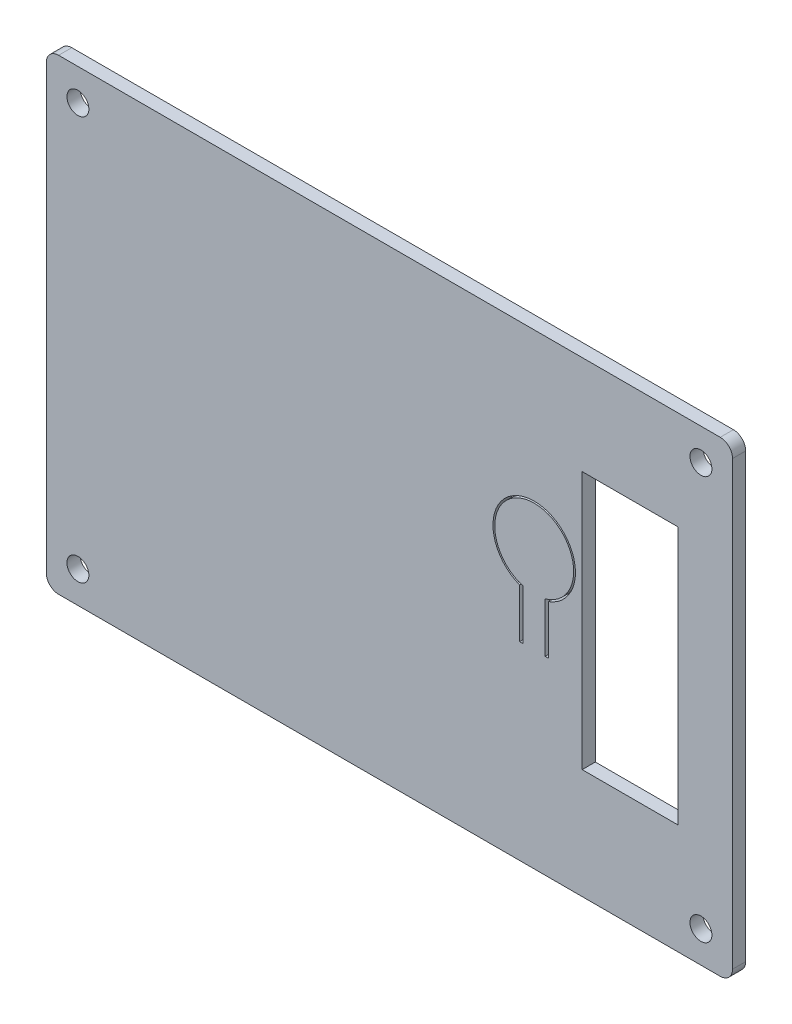
ISO-10303-21;
HEADER;
FILE_DESCRIPTION(('STEP AP214'),'2;1');
FILE_NAME('part.step','',(''),(''),'','','');
FILE_SCHEMA(('AUTOMOTIVE_DESIGN { 1 0 10303 214 1 1 1 1 }'));
ENDSEC;
DATA;
#1=APPLICATION_CONTEXT('core data for automotive mechanical design processes');
#2=APPLICATION_PROTOCOL_DEFINITION('international standard','automotive_design',2000,#1);
#3=PRODUCT_CONTEXT('',#1,'mechanical');
#4=PRODUCT('Part','Part','',(#3));
#5=PRODUCT_RELATED_PRODUCT_CATEGORY('part','',(#4));
#6=PRODUCT_DEFINITION_FORMATION('','',#4);
#7=PRODUCT_DEFINITION_CONTEXT('part definition',#1,'design');
#8=PRODUCT_DEFINITION('design','',#6,#7);
#9=PRODUCT_DEFINITION_SHAPE('','',#8);
#10=(LENGTH_UNIT() NAMED_UNIT(*) SI_UNIT(.MILLI.,.METRE.));
#11=(NAMED_UNIT(*) PLANE_ANGLE_UNIT() SI_UNIT($,.RADIAN.));
#12=(NAMED_UNIT(*) SI_UNIT($,.STERADIAN.) SOLID_ANGLE_UNIT());
#13=UNCERTAINTY_MEASURE_WITH_UNIT(LENGTH_MEASURE(1.E-05),#10,'distance_accuracy_value','');
#14=(GEOMETRIC_REPRESENTATION_CONTEXT(3) GLOBAL_UNCERTAINTY_ASSIGNED_CONTEXT((#13)) GLOBAL_UNIT_ASSIGNED_CONTEXT((#10,
#11,#12)) REPRESENTATION_CONTEXT('',''));
#15=CARTESIAN_POINT('',(0.,0.,0.));
#16=DIRECTION('',(0.,0.,1.));
#17=DIRECTION('',(1.,0.,0.));
#18=AXIS2_PLACEMENT_3D('',#15,#16,#17);
#19=CARTESIAN_POINT('',(0.,-4.27563523380666,11.7430789084998));
#20=DIRECTION('',(0.,-1.,0.));
#21=DIRECTION('',(0.,0.,-1.));
#22=AXIS2_PLACEMENT_3D('',#19,#20,#21);
#23=PLANE('',#22);
#24=DIRECTION('',(0.,0.,1.));
#25=VECTOR('',#24,1.);
#26=CARTESIAN_POINT('',(5.71503973713821,-4.27563523380666,11.7430789084998));
#27=LINE('',#26,#25);
#28=CARTESIAN_POINT('',(5.71503973713821,-4.27563523380666,12.7430789084998));
#29=VERTEX_POINT('',#28);
#30=CARTESIAN_POINT('',(5.71503973713821,-4.27563523380666,14.2430789084998));
#31=VERTEX_POINT('',#30);
#32=EDGE_CURVE('E207',#29,#31,#27,.T.);
#33=ORIENTED_EDGE('',*,*,#32,.F.);
#34=DIRECTION('',(-1.,0.,0.));
#35=VECTOR('',#34,1.);
#36=CARTESIAN_POINT('',(28.1648587015572,-4.27563523380666,12.7430789084998));
#37=LINE('',#36,#35);
#38=CARTESIAN_POINT('',(5.31503973713821,-4.27563523380666,12.7430789084998));
#39=VERTEX_POINT('',#38);
#40=EDGE_CURVE('E547',#29,#39,#37,.T.);
#41=ORIENTED_EDGE('',*,*,#40,.T.);
#42=DIRECTION('',(0.,0.,1.));
#43=VECTOR('',#42,1.);
#44=CARTESIAN_POINT('',(5.31503973713821,-4.27563523380666,11.7430789084998));
#45=LINE('',#44,#43);
#46=CARTESIAN_POINT('',(5.31503973713821,-4.27563523380666,14.2430789084998));
#47=VERTEX_POINT('',#46);
#48=EDGE_CURVE('E366',#39,#47,#45,.T.);
#49=ORIENTED_EDGE('',*,*,#48,.T.);
#50=DIRECTION('',(-1.,0.,0.));
#51=VECTOR('',#50,1.);
#52=CARTESIAN_POINT('',(0.,-4.27563523380666,14.2430789084998));
#53=LINE('',#52,#51);
#54=EDGE_CURVE('E585',#31,#47,#53,.T.);
#55=ORIENTED_EDGE('',*,*,#54,.F.);
#56=EDGE_LOOP('',(#33,#41,#49,#55));
#57=FACE_BOUND('',#56,.T.);
#58=ADVANCED_FACE('F191',(#57),#23,.F.);
#59=CARTESIAN_POINT('',(28.1648587015572,-24.4756371411557,14.2430789084998));
#60=DIRECTION('',(0.,0.,1.));
#61=DIRECTION('',(1.,0.,0.));
#62=AXIS2_PLACEMENT_3D('',#59,#60,#61);
#63=PLANE('',#62);
#64=CARTESIAN_POINT('',(-45.0351412984428,-22.2756371411557,14.2430789084998));
#65=DIRECTION('',(0.,0.,1.));
#66=DIRECTION('',(1.,0.,0.));
#67=AXIS2_PLACEMENT_3D('',#64,#65,#66);
#68=CIRCLE('',#67,1.25);
#69=CARTESIAN_POINT('',(-43.7851412984428,-22.2756371411557,14.2430789084998));
#70=VERTEX_POINT('',#69);
#71=EDGE_CURVE('E390',#70,#70,#68,.T.);
#72=ORIENTED_EDGE('',*,*,#71,.F.);
#73=EDGE_LOOP('',(#72));
#74=FACE_BOUND('',#73,.T.);
#75=CARTESIAN_POINT('',(25.9648587015572,23.7243628588443,14.2430789084998));
#76=DIRECTION('',(0.,0.,1.));
#77=DIRECTION('',(1.,0.,0.));
#78=AXIS2_PLACEMENT_3D('',#75,#76,#77);
#79=CIRCLE('',#78,1.25);
#80=CARTESIAN_POINT('',(27.2148587015572,23.7243628588443,14.2430789084998));
#81=VERTEX_POINT('',#80);
#82=EDGE_CURVE('E450',#81,#81,#79,.T.);
#83=ORIENTED_EDGE('',*,*,#82,.F.);
#84=EDGE_LOOP('',(#83));
#85=FACE_BOUND('',#84,.T.);
#86=CARTESIAN_POINT('',(28.1648587015572,-24.4756371411557,14.2430789084998));
#87=DIRECTION('',(0.,0.,1.));
#88=DIRECTION('',(1.,0.,0.));
#89=AXIS2_PLACEMENT_3D('',#86,#87,#88);
#90=CIRCLE('',#89,1.4);
#91=CARTESIAN_POINT('',(28.1648587015572,-25.8756371411557,14.2430789084998));
#92=VERTEX_POINT('',#91);
#93=CARTESIAN_POINT('',(29.5648587015572,-24.4756371411557,14.2430789084998));
#94=VERTEX_POINT('',#93);
#95=EDGE_CURVE('E458',#92,#94,#90,.T.);
#96=ORIENTED_EDGE('',*,*,#95,.T.);
#97=DIRECTION('',(0.,1.,0.));
#98=VECTOR('',#97,1.);
#99=CARTESIAN_POINT('',(29.5648587015572,-24.4756371411557,14.2430789084998));
#100=LINE('',#99,#98);
#101=CARTESIAN_POINT('',(29.5648587015572,25.9243628588443,14.2430789084998));
#102=VERTEX_POINT('',#101);
#103=EDGE_CURVE('E462',#94,#102,#100,.T.);
#104=ORIENTED_EDGE('',*,*,#103,.T.);
#105=CARTESIAN_POINT('',(28.1648587015572,25.9243628588443,14.2430789084998));
#106=DIRECTION('',(0.,0.,1.));
#107=DIRECTION('',(1.,0.,0.));
#108=AXIS2_PLACEMENT_3D('',#105,#106,#107);
#109=CIRCLE('',#108,1.4);
#110=CARTESIAN_POINT('',(28.1648587015572,27.3243628588443,14.2430789084998));
#111=VERTEX_POINT('',#110);
#112=EDGE_CURVE('E466',#102,#111,#109,.T.);
#113=ORIENTED_EDGE('',*,*,#112,.T.);
#114=DIRECTION('',(-1.,0.,0.));
#115=VECTOR('',#114,1.);
#116=CARTESIAN_POINT('',(28.1648587015572,27.3243628588443,14.2430789084998));
#117=LINE('',#116,#115);
#118=CARTESIAN_POINT('',(-47.2351412984428,27.3243628588443,14.2430789084998));
#119=VERTEX_POINT('',#118);
#120=EDGE_CURVE('E469',#111,#119,#117,.T.);
#121=ORIENTED_EDGE('',*,*,#120,.T.);
#122=CARTESIAN_POINT('',(-47.2351412984428,25.9243628588443,14.2430789084998));
#123=DIRECTION('',(0.,0.,1.));
#124=DIRECTION('',(1.,0.,0.));
#125=AXIS2_PLACEMENT_3D('',#122,#123,#124);
#126=CIRCLE('',#125,1.4);
#127=CARTESIAN_POINT('',(-48.6351412984428,25.9243628588443,14.2430789084998));
#128=VERTEX_POINT('',#127);
#129=EDGE_CURVE('E472',#119,#128,#126,.T.);
#130=ORIENTED_EDGE('',*,*,#129,.T.);
#131=DIRECTION('',(0.,-1.,0.));
#132=VECTOR('',#131,1.);
#133=CARTESIAN_POINT('',(-48.6351412984428,25.9243628588443,14.2430789084998));
#134=LINE('',#133,#132);
#135=CARTESIAN_POINT('',(-48.6351412984428,-24.4756371411557,14.2430789084998));
#136=VERTEX_POINT('',#135);
#137=EDGE_CURVE('E475',#128,#136,#134,.T.);
#138=ORIENTED_EDGE('',*,*,#137,.T.);
#139=CARTESIAN_POINT('',(-47.2351412984428,-24.4756371411557,14.2430789084998));
#140=DIRECTION('',(0.,0.,1.));
#141=DIRECTION('',(1.,0.,0.));
#142=AXIS2_PLACEMENT_3D('',#139,#140,#141);
#143=CIRCLE('',#142,1.4);
#144=CARTESIAN_POINT('',(-47.2351412984428,-25.8756371411557,14.2430789084998));
#145=VERTEX_POINT('',#144);
#146=EDGE_CURVE('E478',#136,#145,#143,.T.);
#147=ORIENTED_EDGE('',*,*,#146,.T.);
#148=DIRECTION('',(1.,0.,0.));
#149=VECTOR('',#148,1.);
#150=CARTESIAN_POINT('',(-47.2351412984428,-25.8756371411557,14.2430789084998));
#151=LINE('',#150,#149);
#152=EDGE_CURVE('E481',#145,#92,#151,.T.);
#153=ORIENTED_EDGE('',*,*,#152,.T.);
#154=EDGE_LOOP('',(#96,#104,#113,#121,#130,#138,#147,#153));
#155=FACE_BOUND('',#154,.T.);
#156=CARTESIAN_POINT('',(25.9648587015572,-22.2756371411557,14.2430789084998));
#157=DIRECTION('',(0.,0.,1.));
#158=DIRECTION('',(1.,0.,0.));
#159=AXIS2_PLACEMENT_3D('',#156,#157,#158);
#160=CIRCLE('',#159,1.25);
#161=CARTESIAN_POINT('',(27.2148587015572,-22.2756371411557,14.2430789084998));
#162=VERTEX_POINT('',#161);
#163=EDGE_CURVE('E442',#162,#162,#160,.T.);
#164=ORIENTED_EDGE('',*,*,#163,.F.);
#165=EDGE_LOOP('',(#164));
#166=FACE_BOUND('',#165,.T.);
#167=DIRECTION('',(0.,-1.,0.));
#168=VECTOR('',#167,1.);
#169=CARTESIAN_POINT('',(12.4296106449812,0.,14.2430789084998));
#170=LINE('',#169,#168);
#171=CARTESIAN_POINT('',(12.4296106449812,16.0711430675286,14.2430789084998));
#172=VERTEX_POINT('',#171);
#173=CARTESIAN_POINT('',(12.4296106449812,-13.3426586904682,14.2430789084998));
#174=VERTEX_POINT('',#173);
#175=EDGE_CURVE('E401',#172,#174,#170,.T.);
#176=ORIENTED_EDGE('',*,*,#175,.F.);
#177=DIRECTION('',(-1.,0.,0.));
#178=VECTOR('',#177,1.);
#179=CARTESIAN_POINT('',(0.,16.0711430675286,14.2430789084998));
#180=LINE('',#179,#178);
#181=CARTESIAN_POINT('',(23.3551703187716,16.0711430675286,14.2430789084998));
#182=VERTEX_POINT('',#181);
#183=EDGE_CURVE('E398',#182,#172,#180,.T.);
#184=ORIENTED_EDGE('',*,*,#183,.F.);
#185=DIRECTION('',(0.,-1.,0.));
#186=VECTOR('',#185,1.);
#187=CARTESIAN_POINT('',(23.3551703187716,0.,14.2430789084998));
#188=LINE('',#187,#186);
#189=CARTESIAN_POINT('',(23.3551703187716,-13.3426586904682,14.2430789084998));
#190=VERTEX_POINT('',#189);
#191=EDGE_CURVE('E409',#182,#190,#188,.T.);
#192=ORIENTED_EDGE('',*,*,#191,.T.);
#193=DIRECTION('',(-1.,0.,0.));
#194=VECTOR('',#193,1.);
#195=CARTESIAN_POINT('',(0.,-13.3426586904682,14.2430789084998));
#196=LINE('',#195,#194);
#197=EDGE_CURVE('E405',#190,#174,#196,.T.);
#198=ORIENTED_EDGE('',*,*,#197,.T.);
#199=EDGE_LOOP('',(#176,#184,#192,#198));
#200=FACE_BOUND('',#199,.T.);
#201=CARTESIAN_POINT('',(-45.0351412984428,23.7243628588443,14.2430789084998));
#202=DIRECTION('',(0.,0.,1.));
#203=DIRECTION('',(1.,0.,0.));
#204=AXIS2_PLACEMENT_3D('',#201,#202,#203);
#205=CIRCLE('',#204,1.25);
#206=CARTESIAN_POINT('',(-43.7851412984428,23.7243628588443,14.2430789084998));
#207=VERTEX_POINT('',#206);
#208=EDGE_CURVE('E380',#207,#207,#205,.T.);
#209=ORIENTED_EDGE('',*,*,#208,.F.);
#210=EDGE_LOOP('',(#209));
#211=FACE_BOUND('',#210,.T.);
#212=CARTESIAN_POINT('',(6.96485870155721,5.72436476619334,14.2430789084998));
#213=DIRECTION('',(0.,0.,1.));
#214=DIRECTION('',(1.,0.,0.));
#215=AXIS2_PLACEMENT_3D('',#212,#213,#214);
#216=CIRCLE('',#215,4.7);
#217=CARTESIAN_POINT('',(8.61467766597621,1.3234447050421,14.2430789084998));
#218=VERTEX_POINT('',#217);
#219=CARTESIAN_POINT('',(5.31503973713821,1.3234447050421,14.2430789084998));
#220=VERTEX_POINT('',#219);
#221=EDGE_CURVE('E593',#218,#220,#216,.T.);
#222=ORIENTED_EDGE('',*,*,#221,.F.);
#223=DIRECTION('',(0.,-1.,0.));
#224=VECTOR('',#223,1.);
#225=CARTESIAN_POINT('',(8.61467766597621,0.,14.2430789084998));
#226=LINE('',#225,#224);
#227=CARTESIAN_POINT('',(8.61467766597621,-4.27563523380666,14.2430789084998));
#228=VERTEX_POINT('',#227);
#229=EDGE_CURVE('E345',#218,#228,#226,.T.);
#230=ORIENTED_EDGE('',*,*,#229,.T.);
#231=DIRECTION('',(1.,0.,0.));
#232=VECTOR('',#231,1.);
#233=CARTESIAN_POINT('',(0.,-4.27563523380666,14.2430789084998));
#234=LINE('',#233,#232);
#235=CARTESIAN_POINT('',(8.21467766597621,-4.27563523380666,14.2430789084998));
#236=VERTEX_POINT('',#235);
#237=EDGE_CURVE('E379',#236,#228,#234,.T.);
#238=ORIENTED_EDGE('',*,*,#237,.F.);
#239=DIRECTION('',(0.,-1.,0.));
#240=VECTOR('',#239,1.);
#241=CARTESIAN_POINT('',(8.21467766597621,0.,14.2430789084998));
#242=LINE('',#241,#240);
#243=CARTESIAN_POINT('',(8.2146776659762,1.40140830606346,14.2430789084998));
#244=VERTEX_POINT('',#243);
#245=EDGE_CURVE('E577',#244,#236,#242,.T.);
#246=ORIENTED_EDGE('',*,*,#245,.F.);
#247=CARTESIAN_POINT('',(6.96485870155721,5.72436476619334,14.2430789084998));
#248=DIRECTION('',(0.,0.,1.));
#249=DIRECTION('',(1.,0.,0.));
#250=AXIS2_PLACEMENT_3D('',#247,#248,#249);
#251=CIRCLE('',#250,4.5);
#252=CARTESIAN_POINT('',(5.71503973713821,1.40140830606346,14.2430789084998));
#253=VERTEX_POINT('',#252);
#254=EDGE_CURVE('E580',#244,#253,#251,.T.);
#255=ORIENTED_EDGE('',*,*,#254,.T.);
#256=DIRECTION('',(0.,-1.,0.));
#257=VECTOR('',#256,1.);
#258=CARTESIAN_POINT('',(5.71503973713821,0.,14.2430789084998));
#259=LINE('',#258,#257);
#260=EDGE_CURVE('E359',#253,#31,#259,.T.);
#261=ORIENTED_EDGE('',*,*,#260,.T.);
#262=ORIENTED_EDGE('',*,*,#54,.T.);
#263=DIRECTION('',(0.,-1.,0.));
#264=VECTOR('',#263,1.);
#265=CARTESIAN_POINT('',(5.31503973713821,0.,14.2430789084998));
#266=LINE('',#265,#264);
#267=EDGE_CURVE('E589',#220,#47,#266,.T.);
#268=ORIENTED_EDGE('',*,*,#267,.F.);
#269=EDGE_LOOP('',(#222,#230,#238,#246,#255,#261,#262,#268));
#270=FACE_BOUND('',#269,.T.);
#271=ADVANCED_FACE('F606',(#74,#85,#155,#166,#200,#211,#270),#63,.T.);
#272=CARTESIAN_POINT('',(28.1648587015572,-24.4756371411557,12.7430789084998));
#273=DIRECTION('',(0.,0.,1.));
#274=DIRECTION('',(1.,0.,0.));
#275=AXIS2_PLACEMENT_3D('',#272,#273,#274);
#276=PLANE('',#275);
#277=CARTESIAN_POINT('',(-45.0351412984428,23.7243628588443,12.7430789084998));
#278=DIRECTION('',(0.,0.,1.));
#279=DIRECTION('',(1.,0.,0.));
#280=AXIS2_PLACEMENT_3D('',#277,#278,#279);
#281=CIRCLE('',#280,1.25);
#282=CARTESIAN_POINT('',(-43.7851412984428,23.7243628588443,12.7430789084998));
#283=VERTEX_POINT('',#282);
#284=EDGE_CURVE('E385',#283,#283,#281,.T.);
#285=ORIENTED_EDGE('',*,*,#284,.T.);
#286=EDGE_LOOP('',(#285));
#287=FACE_BOUND('',#286,.T.);
#288=CARTESIAN_POINT('',(-45.0351412984428,-22.2756371411557,12.7430789084998));
#289=DIRECTION('',(0.,0.,1.));
#290=DIRECTION('',(1.,0.,0.));
#291=AXIS2_PLACEMENT_3D('',#288,#289,#290);
#292=CIRCLE('',#291,1.25);
#293=CARTESIAN_POINT('',(-43.7851412984428,-22.2756371411557,12.7430789084998));
#294=VERTEX_POINT('',#293);
#295=EDGE_CURVE('E384',#294,#294,#292,.T.);
#296=ORIENTED_EDGE('',*,*,#295,.T.);
#297=EDGE_LOOP('',(#296));
#298=FACE_BOUND('',#297,.T.);
#299=DIRECTION('',(-1.,0.,0.));
#300=VECTOR('',#299,1.);
#301=CARTESIAN_POINT('',(0.,16.0711430675286,12.7430789084998));
#302=LINE('',#301,#300);
#303=CARTESIAN_POINT('',(23.3551703187716,16.0711430675286,12.7430789084998));
#304=VERTEX_POINT('',#303);
#305=CARTESIAN_POINT('',(12.4296106449812,16.0711430675286,12.7430789084998));
#306=VERTEX_POINT('',#305);
#307=EDGE_CURVE('E394',#304,#306,#302,.T.);
#308=ORIENTED_EDGE('',*,*,#307,.T.);
#309=DIRECTION('',(0.,-1.,0.));
#310=VECTOR('',#309,1.);
#311=CARTESIAN_POINT('',(12.4296106449812,0.,12.7430789084998));
#312=LINE('',#311,#310);
#313=CARTESIAN_POINT('',(12.4296106449812,-13.3426586904682,12.7430789084998));
#314=VERTEX_POINT('',#313);
#315=EDGE_CURVE('E417',#306,#314,#312,.T.);
#316=ORIENTED_EDGE('',*,*,#315,.T.);
#317=DIRECTION('',(-1.,0.,0.));
#318=VECTOR('',#317,1.);
#319=CARTESIAN_POINT('',(0.,-13.3426586904682,12.7430789084998));
#320=LINE('',#319,#318);
#321=CARTESIAN_POINT('',(23.3551703187716,-13.3426586904682,12.7430789084998));
#322=VERTEX_POINT('',#321);
#323=EDGE_CURVE('E421',#322,#314,#320,.T.);
#324=ORIENTED_EDGE('',*,*,#323,.F.);
#325=DIRECTION('',(0.,-1.,0.));
#326=VECTOR('',#325,1.);
#327=CARTESIAN_POINT('',(23.3551703187716,0.,12.7430789084998));
#328=LINE('',#327,#326);
#329=EDGE_CURVE('E402',#304,#322,#328,.T.);
#330=ORIENTED_EDGE('',*,*,#329,.F.);
#331=EDGE_LOOP('',(#308,#316,#324,#330));
#332=FACE_BOUND('',#331,.T.);
#333=CARTESIAN_POINT('',(28.1648587015572,-24.4756371411557,12.7430789084998));
#334=DIRECTION('',(0.,0.,1.));
#335=DIRECTION('',(1.,0.,0.));
#336=AXIS2_PLACEMENT_3D('',#333,#334,#335);
#337=CIRCLE('',#336,1.4);
#338=CARTESIAN_POINT('',(28.1648587015572,-25.8756371411557,12.7430789084998));
#339=VERTEX_POINT('',#338);
#340=CARTESIAN_POINT('',(29.5648587015572,-24.4756371411557,12.7430789084998));
#341=VERTEX_POINT('',#340);
#342=EDGE_CURVE('E454',#339,#341,#337,.T.);
#343=ORIENTED_EDGE('',*,*,#342,.F.);
#344=DIRECTION('',(1.,0.,0.));
#345=VECTOR('',#344,1.);
#346=CARTESIAN_POINT('',(-47.2351412984428,-25.8756371411557,12.7430789084998));
#347=LINE('',#346,#345);
#348=CARTESIAN_POINT('',(-47.2351412984428,-25.8756371411557,12.7430789084998));
#349=VERTEX_POINT('',#348);
#350=EDGE_CURVE('E463',#349,#339,#347,.T.);
#351=ORIENTED_EDGE('',*,*,#350,.F.);
#352=CARTESIAN_POINT('',(-47.2351412984428,-24.4756371411557,12.7430789084998));
#353=DIRECTION('',(0.,0.,1.));
#354=DIRECTION('',(1.,0.,0.));
#355=AXIS2_PLACEMENT_3D('',#352,#353,#354);
#356=CIRCLE('',#355,1.4);
#357=CARTESIAN_POINT('',(-48.6351412984428,-24.4756371411557,12.7430789084998));
#358=VERTEX_POINT('',#357);
#359=EDGE_CURVE('E503',#358,#349,#356,.T.);
#360=ORIENTED_EDGE('',*,*,#359,.F.);
#361=DIRECTION('',(0.,-1.,0.));
#362=VECTOR('',#361,1.);
#363=CARTESIAN_POINT('',(-48.6351412984428,25.9243628588443,12.7430789084998));
#364=LINE('',#363,#362);
#365=CARTESIAN_POINT('',(-48.6351412984428,25.9243628588443,12.7430789084998));
#366=VERTEX_POINT('',#365);
#367=EDGE_CURVE('E500',#366,#358,#364,.T.);
#368=ORIENTED_EDGE('',*,*,#367,.F.);
#369=CARTESIAN_POINT('',(-47.2351412984428,25.9243628588443,12.7430789084998));
#370=DIRECTION('',(0.,0.,1.));
#371=DIRECTION('',(1.,0.,0.));
#372=AXIS2_PLACEMENT_3D('',#369,#370,#371);
#373=CIRCLE('',#372,1.4);
#374=CARTESIAN_POINT('',(-47.2351412984428,27.3243628588443,12.7430789084998));
#375=VERTEX_POINT('',#374);
#376=EDGE_CURVE('E497',#375,#366,#373,.T.);
#377=ORIENTED_EDGE('',*,*,#376,.F.);
#378=DIRECTION('',(-1.,0.,0.));
#379=VECTOR('',#378,1.);
#380=CARTESIAN_POINT('',(28.1648587015572,27.3243628588443,12.7430789084998));
#381=LINE('',#380,#379);
#382=CARTESIAN_POINT('',(28.1648587015572,27.3243628588443,12.7430789084998));
#383=VERTEX_POINT('',#382);
#384=EDGE_CURVE('E494',#383,#375,#381,.T.);
#385=ORIENTED_EDGE('',*,*,#384,.F.);
#386=CARTESIAN_POINT('',(28.1648587015572,25.9243628588443,12.7430789084998));
#387=DIRECTION('',(0.,0.,1.));
#388=DIRECTION('',(1.,0.,0.));
#389=AXIS2_PLACEMENT_3D('',#386,#387,#388);
#390=CIRCLE('',#389,1.4);
#391=CARTESIAN_POINT('',(29.5648587015572,25.9243628588443,12.7430789084998));
#392=VERTEX_POINT('',#391);
#393=EDGE_CURVE('E491',#392,#383,#390,.T.);
#394=ORIENTED_EDGE('',*,*,#393,.F.);
#395=DIRECTION('',(0.,1.,0.));
#396=VECTOR('',#395,1.);
#397=CARTESIAN_POINT('',(29.5648587015572,-24.4756371411557,12.7430789084998));
#398=LINE('',#397,#396);
#399=EDGE_CURVE('E488',#341,#392,#398,.T.);
#400=ORIENTED_EDGE('',*,*,#399,.F.);
#401=EDGE_LOOP('',(#343,#351,#360,#368,#377,#385,#394,#400));
#402=FACE_BOUND('',#401,.T.);
#403=CARTESIAN_POINT('',(25.9648587015572,23.7243628588443,12.7430789084998));
#404=DIRECTION('',(0.,0.,1.));
#405=DIRECTION('',(1.,0.,0.));
#406=AXIS2_PLACEMENT_3D('',#403,#404,#405);
#407=CIRCLE('',#406,1.25);
#408=CARTESIAN_POINT('',(27.2148587015572,23.7243628588443,12.7430789084998));
#409=VERTEX_POINT('',#408);
#410=EDGE_CURVE('E446',#409,#409,#407,.T.);
#411=ORIENTED_EDGE('',*,*,#410,.T.);
#412=EDGE_LOOP('',(#411));
#413=FACE_BOUND('',#412,.T.);
#414=CARTESIAN_POINT('',(25.9648587015572,-22.2756371411557,12.7430789084998));
#415=DIRECTION('',(0.,0.,1.));
#416=DIRECTION('',(1.,0.,0.));
#417=AXIS2_PLACEMENT_3D('',#414,#415,#416);
#418=CIRCLE('',#417,1.25);
#419=CARTESIAN_POINT('',(27.2148587015572,-22.2756371411557,12.7430789084998));
#420=VERTEX_POINT('',#419);
#421=EDGE_CURVE('E441',#420,#420,#418,.T.);
#422=ORIENTED_EDGE('',*,*,#421,.T.);
#423=EDGE_LOOP('',(#422));
#424=FACE_BOUND('',#423,.T.);
#425=CARTESIAN_POINT('',(8.61467766597621,-4.27563523380666,12.7430789084998));
#426=VERTEX_POINT('',#425);
#427=CARTESIAN_POINT('',(8.21467766597621,-4.27563523380666,12.7430789084998));
#428=VERTEX_POINT('',#427);
#429=EDGE_CURVE('E548',#426,#428,#37,.T.);
#430=ORIENTED_EDGE('',*,*,#429,.F.);
#431=DIRECTION('',(0.,-1.,0.));
#432=VECTOR('',#431,1.);
#433=CARTESIAN_POINT('',(8.61467766597621,-24.4756371411557,12.7430789084998));
#434=LINE('',#433,#432);
#435=CARTESIAN_POINT('',(8.61467766597621,1.3234447050421,12.7430789084998));
#436=VERTEX_POINT('',#435);
#437=EDGE_CURVE('E552',#436,#426,#434,.T.);
#438=ORIENTED_EDGE('',*,*,#437,.F.);
#439=CARTESIAN_POINT('',(6.96485870155721,5.72436476619334,12.7430789084998));
#440=DIRECTION('',(0.,0.,1.));
#441=DIRECTION('',(1.,0.,0.));
#442=AXIS2_PLACEMENT_3D('',#439,#440,#441);
#443=CIRCLE('',#442,4.7);
#444=CARTESIAN_POINT('',(5.31503973713821,1.3234447050421,12.7430789084998));
#445=VERTEX_POINT('',#444);
#446=EDGE_CURVE('E539',#436,#445,#443,.T.);
#447=ORIENTED_EDGE('',*,*,#446,.T.);
#448=DIRECTION('',(0.,-1.,0.));
#449=VECTOR('',#448,1.);
#450=CARTESIAN_POINT('',(5.31503973713821,-24.4756371411557,12.7430789084998));
#451=LINE('',#450,#449);
#452=EDGE_CURVE('E543',#445,#39,#451,.T.);
#453=ORIENTED_EDGE('',*,*,#452,.T.);
#454=ORIENTED_EDGE('',*,*,#40,.F.);
#455=EDGE_CURVE('E553',#428,#29,#37,.T.);
#456=ORIENTED_EDGE('',*,*,#455,.F.);
#457=EDGE_LOOP('',(#430,#438,#447,#453,#454,#456));
#458=FACE_BOUND('',#457,.T.);
#459=ADVANCED_FACE('F563',(#287,#298,#332,#402,#413,#424,#458),#276,.F.);
#460=CARTESIAN_POINT('',(28.1648587015572,-24.4756371411557,14.2430789084998));
#461=DIRECTION('',(0.,0.,-1.));
#462=DIRECTION('',(-1.,0.,0.));
#463=AXIS2_PLACEMENT_3D('',#460,#461,#462);
#464=CYLINDRICAL_SURFACE('',#463,1.4);
#465=ORIENTED_EDGE('',*,*,#342,.T.);
#466=DIRECTION('',(0.,0.,-1.));
#467=VECTOR('',#466,1.);
#468=CARTESIAN_POINT('',(29.5648587015572,-24.4756371411557,14.2430789084998));
#469=LINE('',#468,#467);
#470=EDGE_CURVE('E535',#94,#341,#469,.T.);
#471=ORIENTED_EDGE('',*,*,#470,.F.);
#472=ORIENTED_EDGE('',*,*,#95,.F.);
#473=DIRECTION('',(0.,0.,-1.));
#474=VECTOR('',#473,1.);
#475=CARTESIAN_POINT('',(28.1648587015572,-25.8756371411557,14.2430789084998));
#476=LINE('',#475,#474);
#477=EDGE_CURVE('E484',#92,#339,#476,.T.);
#478=ORIENTED_EDGE('',*,*,#477,.T.);
#479=EDGE_LOOP('',(#465,#471,#472,#478));
#480=FACE_BOUND('',#479,.T.);
#481=ADVANCED_FACE('F673',(#480),#464,.T.);
#482=CARTESIAN_POINT('',(29.5648587015572,-24.4756371411557,14.2430789084998));
#483=DIRECTION('',(-1.,0.,0.));
#484=DIRECTION('',(0.,0.,1.));
#485=AXIS2_PLACEMENT_3D('',#482,#483,#484);
#486=PLANE('',#485);
#487=ORIENTED_EDGE('',*,*,#399,.T.);
#488=DIRECTION('',(0.,0.,-1.));
#489=VECTOR('',#488,1.);
#490=CARTESIAN_POINT('',(29.5648587015572,25.9243628588443,14.2430789084998));
#491=LINE('',#490,#489);
#492=EDGE_CURVE('E531',#102,#392,#491,.T.);
#493=ORIENTED_EDGE('',*,*,#492,.F.);
#494=ORIENTED_EDGE('',*,*,#103,.F.);
#495=ORIENTED_EDGE('',*,*,#470,.T.);
#496=EDGE_LOOP('',(#487,#493,#494,#495));
#497=FACE_BOUND('',#496,.T.);
#498=ADVANCED_FACE('F697',(#497),#486,.F.);
#499=CARTESIAN_POINT('',(28.1648587015572,25.9243628588443,14.2430789084998));
#500=DIRECTION('',(0.,0.,-1.));
#501=DIRECTION('',(-1.,0.,0.));
#502=AXIS2_PLACEMENT_3D('',#499,#500,#501);
#503=CYLINDRICAL_SURFACE('',#502,1.4);
#504=ORIENTED_EDGE('',*,*,#393,.T.);
#505=DIRECTION('',(0.,0.,-1.));
#506=VECTOR('',#505,1.);
#507=CARTESIAN_POINT('',(28.1648587015572,27.3243628588443,14.2430789084998));
#508=LINE('',#507,#506);
#509=EDGE_CURVE('E527',#111,#383,#508,.T.);
#510=ORIENTED_EDGE('',*,*,#509,.F.);
#511=ORIENTED_EDGE('',*,*,#112,.F.);
#512=ORIENTED_EDGE('',*,*,#492,.T.);
#513=EDGE_LOOP('',(#504,#510,#511,#512));
#514=FACE_BOUND('',#513,.T.);
#515=ADVANCED_FACE('F693',(#514),#503,.T.);
#516=CARTESIAN_POINT('',(28.1648587015572,27.3243628588443,14.2430789084998));
#517=DIRECTION('',(0.,-1.,0.));
#518=DIRECTION('',(0.,0.,-1.));
#519=AXIS2_PLACEMENT_3D('',#516,#517,#518);
#520=PLANE('',#519);
#521=ORIENTED_EDGE('',*,*,#384,.T.);
#522=DIRECTION('',(0.,0.,-1.));
#523=VECTOR('',#522,1.);
#524=CARTESIAN_POINT('',(-47.2351412984428,27.3243628588443,14.2430789084998));
#525=LINE('',#524,#523);
#526=EDGE_CURVE('E523',#119,#375,#525,.T.);
#527=ORIENTED_EDGE('',*,*,#526,.F.);
#528=ORIENTED_EDGE('',*,*,#120,.F.);
#529=ORIENTED_EDGE('',*,*,#509,.T.);
#530=EDGE_LOOP('',(#521,#527,#528,#529));
#531=FACE_BOUND('',#530,.T.);
#532=ADVANCED_FACE('F689',(#531),#520,.F.);
#533=CARTESIAN_POINT('',(-47.2351412984428,25.9243628588443,14.2430789084998));
#534=DIRECTION('',(0.,0.,-1.));
#535=DIRECTION('',(-1.,0.,0.));
#536=AXIS2_PLACEMENT_3D('',#533,#534,#535);
#537=CYLINDRICAL_SURFACE('',#536,1.4);
#538=ORIENTED_EDGE('',*,*,#376,.T.);
#539=DIRECTION('',(0.,0.,-1.));
#540=VECTOR('',#539,1.);
#541=CARTESIAN_POINT('',(-48.6351412984428,25.9243628588443,14.2430789084998));
#542=LINE('',#541,#540);
#543=EDGE_CURVE('E519',#128,#366,#542,.T.);
#544=ORIENTED_EDGE('',*,*,#543,.F.);
#545=ORIENTED_EDGE('',*,*,#129,.F.);
#546=ORIENTED_EDGE('',*,*,#526,.T.);
#547=EDGE_LOOP('',(#538,#544,#545,#546));
#548=FACE_BOUND('',#547,.T.);
#549=ADVANCED_FACE('F685',(#548),#537,.T.);
#550=CARTESIAN_POINT('',(-48.6351412984428,25.9243628588443,14.2430789084998));
#551=DIRECTION('',(1.,0.,0.));
#552=DIRECTION('',(0.,0.,-1.));
#553=AXIS2_PLACEMENT_3D('',#550,#551,#552);
#554=PLANE('',#553);
#555=ORIENTED_EDGE('',*,*,#367,.T.);
#556=DIRECTION('',(0.,0.,-1.));
#557=VECTOR('',#556,1.);
#558=CARTESIAN_POINT('',(-48.6351412984428,-24.4756371411557,14.2430789084998));
#559=LINE('',#558,#557);
#560=EDGE_CURVE('E515',#136,#358,#559,.T.);
#561=ORIENTED_EDGE('',*,*,#560,.F.);
#562=ORIENTED_EDGE('',*,*,#137,.F.);
#563=ORIENTED_EDGE('',*,*,#543,.T.);
#564=EDGE_LOOP('',(#555,#561,#562,#563));
#565=FACE_BOUND('',#564,.T.);
#566=ADVANCED_FACE('F681',(#565),#554,.F.);
#567=CARTESIAN_POINT('',(-47.2351412984428,-24.4756371411557,14.2430789084998));
#568=DIRECTION('',(0.,0.,-1.));
#569=DIRECTION('',(-1.,0.,0.));
#570=AXIS2_PLACEMENT_3D('',#567,#568,#569);
#571=CYLINDRICAL_SURFACE('',#570,1.4);
#572=ORIENTED_EDGE('',*,*,#359,.T.);
#573=DIRECTION('',(0.,0.,-1.));
#574=VECTOR('',#573,1.);
#575=CARTESIAN_POINT('',(-47.2351412984428,-25.8756371411557,14.2430789084998));
#576=LINE('',#575,#574);
#577=EDGE_CURVE('E511',#145,#349,#576,.T.);
#578=ORIENTED_EDGE('',*,*,#577,.F.);
#579=ORIENTED_EDGE('',*,*,#146,.F.);
#580=ORIENTED_EDGE('',*,*,#560,.T.);
#581=EDGE_LOOP('',(#572,#578,#579,#580));
#582=FACE_BOUND('',#581,.T.);
#583=ADVANCED_FACE('F677',(#582),#571,.T.);
#584=CARTESIAN_POINT('',(-47.2351412984428,-25.8756371411557,14.2430789084998));
#585=DIRECTION('',(0.,1.,0.));
#586=DIRECTION('',(0.,0.,1.));
#587=AXIS2_PLACEMENT_3D('',#584,#585,#586);
#588=PLANE('',#587);
#589=ORIENTED_EDGE('',*,*,#350,.T.);
#590=ORIENTED_EDGE('',*,*,#477,.F.);
#591=ORIENTED_EDGE('',*,*,#152,.F.);
#592=ORIENTED_EDGE('',*,*,#577,.T.);
#593=EDGE_LOOP('',(#589,#590,#591,#592));
#594=FACE_BOUND('',#593,.T.);
#595=ADVANCED_FACE('F668',(#594),#588,.F.);
#596=CARTESIAN_POINT('',(25.9648587015572,23.7243628588443,14.2430789084998));
#597=DIRECTION('',(0.,0.,-1.));
#598=DIRECTION('',(-1.,0.,0.));
#599=AXIS2_PLACEMENT_3D('',#596,#597,#598);
#600=CYLINDRICAL_SURFACE('',#599,1.25);
#601=ORIENTED_EDGE('',*,*,#82,.T.);
#602=EDGE_LOOP('',(#601));
#603=FACE_BOUND('',#602,.T.);
#604=ORIENTED_EDGE('',*,*,#410,.F.);
#605=EDGE_LOOP('',(#604));
#606=FACE_BOUND('',#605,.T.);
#607=ADVANCED_FACE('F665',(#603,#606),#600,.F.);
#608=CARTESIAN_POINT('',(25.9648587015572,-22.2756371411557,14.2430789084998));
#609=DIRECTION('',(0.,0.,-1.));
#610=DIRECTION('',(-1.,0.,0.));
#611=AXIS2_PLACEMENT_3D('',#608,#609,#610);
#612=CYLINDRICAL_SURFACE('',#611,1.25);
#613=ORIENTED_EDGE('',*,*,#163,.T.);
#614=EDGE_LOOP('',(#613));
#615=FACE_BOUND('',#614,.T.);
#616=ORIENTED_EDGE('',*,*,#421,.F.);
#617=EDGE_LOOP('',(#616));
#618=FACE_BOUND('',#617,.T.);
#619=ADVANCED_FACE('F661',(#615,#618),#612,.F.);
#620=CARTESIAN_POINT('',(0.,16.0711430675286,14.2430789084998));
#621=DIRECTION('',(0.,-1.,0.));
#622=DIRECTION('',(0.,0.,-1.));
#623=AXIS2_PLACEMENT_3D('',#620,#621,#622);
#624=PLANE('',#623);
#625=ORIENTED_EDGE('',*,*,#307,.F.);
#626=DIRECTION('',(0.,0.,-1.));
#627=VECTOR('',#626,1.);
#628=CARTESIAN_POINT('',(23.3551703187716,16.0711430675286,14.2430789084998));
#629=LINE('',#628,#627);
#630=EDGE_CURVE('E413',#182,#304,#629,.T.);
#631=ORIENTED_EDGE('',*,*,#630,.F.);
#632=ORIENTED_EDGE('',*,*,#183,.T.);
#633=DIRECTION('',(0.,0.,-1.));
#634=VECTOR('',#633,1.);
#635=CARTESIAN_POINT('',(12.4296106449812,16.0711430675286,14.2430789084998));
#636=LINE('',#635,#634);
#637=EDGE_CURVE('E437',#172,#306,#636,.T.);
#638=ORIENTED_EDGE('',*,*,#637,.T.);
#639=EDGE_LOOP('',(#625,#631,#632,#638));
#640=FACE_BOUND('',#639,.T.);
#641=ADVANCED_FACE('F657',(#640),#624,.T.);
#642=CARTESIAN_POINT('',(12.4296106449812,0.,14.2430789084998));
#643=DIRECTION('',(1.,0.,0.));
#644=DIRECTION('',(0.,0.,-1.));
#645=AXIS2_PLACEMENT_3D('',#642,#643,#644);
#646=PLANE('',#645);
#647=ORIENTED_EDGE('',*,*,#315,.F.);
#648=ORIENTED_EDGE('',*,*,#637,.F.);
#649=ORIENTED_EDGE('',*,*,#175,.T.);
#650=DIRECTION('',(0.,0.,-1.));
#651=VECTOR('',#650,1.);
#652=CARTESIAN_POINT('',(12.4296106449812,-13.3426586904682,14.2430789084998));
#653=LINE('',#652,#651);
#654=EDGE_CURVE('E434',#174,#314,#653,.T.);
#655=ORIENTED_EDGE('',*,*,#654,.T.);
#656=EDGE_LOOP('',(#647,#648,#649,#655));
#657=FACE_BOUND('',#656,.T.);
#658=ADVANCED_FACE('F653',(#657),#646,.T.);
#659=CARTESIAN_POINT('',(0.,-13.3426586904682,14.2430789084998));
#660=DIRECTION('',(0.,-1.,0.));
#661=DIRECTION('',(0.,0.,-1.));
#662=AXIS2_PLACEMENT_3D('',#659,#660,#661);
#663=PLANE('',#662);
#664=ORIENTED_EDGE('',*,*,#323,.T.);
#665=ORIENTED_EDGE('',*,*,#654,.F.);
#666=ORIENTED_EDGE('',*,*,#197,.F.);
#667=DIRECTION('',(0.,0.,-1.));
#668=VECTOR('',#667,1.);
#669=CARTESIAN_POINT('',(23.3551703187716,-13.3426586904682,14.2430789084998));
#670=LINE('',#669,#668);
#671=EDGE_CURVE('E431',#190,#322,#670,.T.);
#672=ORIENTED_EDGE('',*,*,#671,.T.);
#673=EDGE_LOOP('',(#664,#665,#666,#672));
#674=FACE_BOUND('',#673,.T.);
#675=ADVANCED_FACE('F649',(#674),#663,.F.);
#676=CARTESIAN_POINT('',(23.3551703187716,0.,14.2430789084998));
#677=DIRECTION('',(1.,0.,0.));
#678=DIRECTION('',(0.,0.,-1.));
#679=AXIS2_PLACEMENT_3D('',#676,#677,#678);
#680=PLANE('',#679);
#681=ORIENTED_EDGE('',*,*,#329,.T.);
#682=ORIENTED_EDGE('',*,*,#671,.F.);
#683=ORIENTED_EDGE('',*,*,#191,.F.);
#684=ORIENTED_EDGE('',*,*,#630,.T.);
#685=EDGE_LOOP('',(#681,#682,#683,#684));
#686=FACE_BOUND('',#685,.T.);
#687=ADVANCED_FACE('F645',(#686),#680,.F.);
#688=CARTESIAN_POINT('',(-45.0351412984428,-22.2756371411557,14.2430789084998));
#689=DIRECTION('',(0.,0.,-1.));
#690=DIRECTION('',(-1.,0.,0.));
#691=AXIS2_PLACEMENT_3D('',#688,#689,#690);
#692=CYLINDRICAL_SURFACE('',#691,1.25);
#693=ORIENTED_EDGE('',*,*,#71,.T.);
#694=EDGE_LOOP('',(#693));
#695=FACE_BOUND('',#694,.T.);
#696=ORIENTED_EDGE('',*,*,#295,.F.);
#697=EDGE_LOOP('',(#696));
#698=FACE_BOUND('',#697,.T.);
#699=ADVANCED_FACE('F637',(#695,#698),#692,.F.);
#700=CARTESIAN_POINT('',(-45.0351412984428,23.7243628588443,14.2430789084998));
#701=DIRECTION('',(0.,0.,-1.));
#702=DIRECTION('',(-1.,0.,0.));
#703=AXIS2_PLACEMENT_3D('',#700,#701,#702);
#704=CYLINDRICAL_SURFACE('',#703,1.25);
#705=ORIENTED_EDGE('',*,*,#208,.T.);
#706=EDGE_LOOP('',(#705));
#707=FACE_BOUND('',#706,.T.);
#708=ORIENTED_EDGE('',*,*,#284,.F.);
#709=EDGE_LOOP('',(#708));
#710=FACE_BOUND('',#709,.T.);
#711=ADVANCED_FACE('F632',(#707,#710),#704,.F.);
#712=CARTESIAN_POINT('',(8.61467766597621,0.,11.7430789084998));
#713=DIRECTION('',(-1.,0.,0.));
#714=DIRECTION('',(0.,-1.,0.));
#715=AXIS2_PLACEMENT_3D('',#712,#713,#714);
#716=PLANE('',#715);
#717=ORIENTED_EDGE('',*,*,#437,.T.);
#718=DIRECTION('',(0.,0.,1.));
#719=VECTOR('',#718,1.);
#720=CARTESIAN_POINT('',(8.61467766597621,-4.27563523380666,11.7430789084998));
#721=LINE('',#720,#719);
#722=EDGE_CURVE('E389',#426,#228,#721,.T.);
#723=ORIENTED_EDGE('',*,*,#722,.T.);
#724=ORIENTED_EDGE('',*,*,#229,.F.);
#725=DIRECTION('',(0.,0.,1.));
#726=VECTOR('',#725,1.);
#727=CARTESIAN_POINT('',(8.61467766597621,1.3234447050421,11.7430789084998));
#728=LINE('',#727,#726);
#729=EDGE_CURVE('E375',#436,#218,#728,.T.);
#730=ORIENTED_EDGE('',*,*,#729,.F.);
#731=EDGE_LOOP('',(#717,#723,#724,#730));
#732=FACE_BOUND('',#731,.T.);
#733=ADVANCED_FACE('F610',(#732),#716,.T.);
#734=ORIENTED_EDGE('',*,*,#429,.T.);
#735=DIRECTION('',(0.,0.,1.));
#736=VECTOR('',#735,1.);
#737=CARTESIAN_POINT('',(8.21467766597621,-4.27563523380666,11.7430789084998));
#738=LINE('',#737,#736);
#739=EDGE_CURVE('E214',#428,#236,#738,.T.);
#740=ORIENTED_EDGE('',*,*,#739,.T.);
#741=ORIENTED_EDGE('',*,*,#237,.T.);
#742=ORIENTED_EDGE('',*,*,#722,.F.);
#743=EDGE_LOOP('',(#734,#740,#741,#742));
#744=FACE_BOUND('',#743,.T.);
#745=ADVANCED_FACE('F608',(#744),#23,.F.);
#746=CARTESIAN_POINT('',(8.21467766597621,0.,11.7430789084998));
#747=DIRECTION('',(-1.,0.,0.));
#748=DIRECTION('',(0.,-1.,0.));
#749=AXIS2_PLACEMENT_3D('',#746,#747,#748);
#750=PLANE('',#749);
#751=ORIENTED_EDGE('',*,*,#739,.F.);
#752=CARTESIAN_POINT('',(8.21467766597621,-3.27563523380666,12.7430789084998));
#753=DIRECTION('',(-1.,0.,0.));
#754=DIRECTION('',(0.,-1.,0.));
#755=AXIS2_PLACEMENT_3D('',#752,#753,#754);
#756=CIRCLE('',#755,1.);
#757=CARTESIAN_POINT('',(8.21467766597621,-3.27563523380666,13.7430789084998));
#758=VERTEX_POINT('',#757);
#759=EDGE_CURVE('E13',#428,#758,#756,.T.);
#760=ORIENTED_EDGE('',*,*,#759,.T.);
#761=DIRECTION('',(0.,-1.,0.));
#762=VECTOR('',#761,1.);
#763=CARTESIAN_POINT('',(8.21467766597621,-24.4756371411557,13.7430789084998));
#764=LINE('',#763,#762);
#765=CARTESIAN_POINT('',(8.21467766597621,1.40140830606347,13.7430789084998));
#766=VERTEX_POINT('',#765);
#767=EDGE_CURVE('E355',#766,#758,#764,.T.);
#768=ORIENTED_EDGE('',*,*,#767,.F.);
#769=DIRECTION('',(0.,0.,1.));
#770=VECTOR('',#769,1.);
#771=CARTESIAN_POINT('',(8.2146776659762,1.40140830606346,11.7430789084998));
#772=LINE('',#771,#770);
#773=EDGE_CURVE('E353',#766,#244,#772,.T.);
#774=ORIENTED_EDGE('',*,*,#773,.T.);
#775=ORIENTED_EDGE('',*,*,#245,.T.);
#776=EDGE_LOOP('',(#751,#760,#768,#774,#775));
#777=FACE_BOUND('',#776,.T.);
#778=ADVANCED_FACE('F601',(#777),#750,.F.);
#779=CARTESIAN_POINT('',(6.96485870155721,5.72436476619334,11.7430789084998));
#780=DIRECTION('',(0.,0.,1.));
#781=DIRECTION('',(1.,0.,0.));
#782=AXIS2_PLACEMENT_3D('',#779,#780,#781);
#783=CYLINDRICAL_SURFACE('',#782,4.5);
#784=CARTESIAN_POINT('',(6.96485870155721,5.72436476619334,13.7430789084998));
#785=DIRECTION('',(0.,0.,1.));
#786=DIRECTION('',(1.,0.,0.));
#787=AXIS2_PLACEMENT_3D('',#784,#785,#786);
#788=CIRCLE('',#787,4.5);
#789=CARTESIAN_POINT('',(5.7150397371382,1.40140830606347,13.7430789084998));
#790=VERTEX_POINT('',#789);
#791=EDGE_CURVE('E338',#766,#790,#788,.T.);
#792=ORIENTED_EDGE('',*,*,#791,.T.);
#793=DIRECTION('',(0.,0.,1.));
#794=VECTOR('',#793,1.);
#795=CARTESIAN_POINT('',(5.71503973713821,1.40140830606346,11.7430789084998));
#796=LINE('',#795,#794);
#797=EDGE_CURVE('E351',#790,#253,#796,.T.);
#798=ORIENTED_EDGE('',*,*,#797,.T.);
#799=ORIENTED_EDGE('',*,*,#254,.F.);
#800=ORIENTED_EDGE('',*,*,#773,.F.);
#801=EDGE_LOOP('',(#792,#798,#799,#800));
#802=FACE_BOUND('',#801,.T.);
#803=ADVANCED_FACE('F349',(#802),#783,.T.);
#804=CARTESIAN_POINT('',(5.71503973713821,0.,11.7430789084998));
#805=DIRECTION('',(-1.,0.,0.));
#806=DIRECTION('',(0.,-1.,0.));
#807=AXIS2_PLACEMENT_3D('',#804,#805,#806);
#808=PLANE('',#807);
#809=DIRECTION('',(0.,-1.,0.));
#810=VECTOR('',#809,1.);
#811=CARTESIAN_POINT('',(5.71503973713821,-24.4756371411557,13.7430789084998));
#812=LINE('',#811,#810);
#813=CARTESIAN_POINT('',(5.71503973713821,-3.27563523380666,13.7430789084998));
#814=VERTEX_POINT('',#813);
#815=EDGE_CURVE('E334',#790,#814,#812,.T.);
#816=ORIENTED_EDGE('',*,*,#815,.T.);
#817=CARTESIAN_POINT('',(5.71503973713821,-3.27563523380666,12.7430789084998));
#818=DIRECTION('',(-1.,0.,0.));
#819=DIRECTION('',(0.,-1.,0.));
#820=AXIS2_PLACEMENT_3D('',#817,#818,#819);
#821=CIRCLE('',#820,1.);
#822=EDGE_CURVE('E200',#814,#29,#821,.F.);
#823=ORIENTED_EDGE('',*,*,#822,.T.);
#824=ORIENTED_EDGE('',*,*,#32,.T.);
#825=ORIENTED_EDGE('',*,*,#260,.F.);
#826=ORIENTED_EDGE('',*,*,#797,.F.);
#827=EDGE_LOOP('',(#816,#823,#824,#825,#826));
#828=FACE_BOUND('',#827,.T.);
#829=ADVANCED_FACE('F357',(#828),#808,.T.);
#830=CARTESIAN_POINT('',(5.31503973713821,0.,11.7430789084998));
#831=DIRECTION('',(-1.,0.,0.));
#832=DIRECTION('',(0.,-1.,0.));
#833=AXIS2_PLACEMENT_3D('',#830,#831,#832);
#834=PLANE('',#833);
#835=DIRECTION('',(0.,0.,1.));
#836=VECTOR('',#835,1.);
#837=CARTESIAN_POINT('',(5.31503973713821,1.3234447050421,11.7430789084998));
#838=LINE('',#837,#836);
#839=EDGE_CURVE('E372',#445,#220,#838,.T.);
#840=ORIENTED_EDGE('',*,*,#839,.T.);
#841=ORIENTED_EDGE('',*,*,#267,.T.);
#842=ORIENTED_EDGE('',*,*,#48,.F.);
#843=ORIENTED_EDGE('',*,*,#452,.F.);
#844=EDGE_LOOP('',(#840,#841,#842,#843));
#845=FACE_BOUND('',#844,.T.);
#846=ADVANCED_FACE('F617',(#845),#834,.F.);
#847=CARTESIAN_POINT('',(6.96485870155721,5.72436476619334,11.7430789084998));
#848=DIRECTION('',(0.,0.,1.));
#849=DIRECTION('',(1.,0.,0.));
#850=AXIS2_PLACEMENT_3D('',#847,#848,#849);
#851=CYLINDRICAL_SURFACE('',#850,4.7);
#852=ORIENTED_EDGE('',*,*,#729,.T.);
#853=ORIENTED_EDGE('',*,*,#221,.T.);
#854=ORIENTED_EDGE('',*,*,#839,.F.);
#855=ORIENTED_EDGE('',*,*,#446,.F.);
#856=EDGE_LOOP('',(#852,#853,#854,#855));
#857=FACE_BOUND('',#856,.T.);
#858=ADVANCED_FACE('F614',(#857),#851,.F.);
#859=CARTESIAN_POINT('',(28.1648587015572,-24.4756371411557,13.7430789084998));
#860=DIRECTION('',(0.,0.,1.));
#861=DIRECTION('',(1.,0.,0.));
#862=AXIS2_PLACEMENT_3D('',#859,#860,#861);
#863=PLANE('',#862);
#864=ORIENTED_EDGE('',*,*,#767,.T.);
#865=DIRECTION('',(-1.,0.,0.));
#866=VECTOR('',#865,1.);
#867=CARTESIAN_POINT('',(5.71503973713821,-3.27563523380666,13.7430789084998));
#868=LINE('',#867,#866);
#869=EDGE_CURVE('E341',#758,#814,#868,.T.);
#870=ORIENTED_EDGE('',*,*,#869,.T.);
#871=ORIENTED_EDGE('',*,*,#815,.F.);
#872=ORIENTED_EDGE('',*,*,#791,.F.);
#873=EDGE_LOOP('',(#864,#870,#871,#872));
#874=FACE_BOUND('',#873,.T.);
#875=ADVANCED_FACE('F337',(#874),#863,.F.);
#876=CARTESIAN_POINT('',(28.1648587015572,-3.27563523380666,12.7430789084998));
#877=DIRECTION('',(1.,0.,0.));
#878=DIRECTION('',(0.,0.,-1.));
#879=AXIS2_PLACEMENT_3D('',#876,#877,#878);
#880=CYLINDRICAL_SURFACE('',#879,1.);
#881=ORIENTED_EDGE('',*,*,#759,.F.);
#882=ORIENTED_EDGE('',*,*,#455,.T.);
#883=ORIENTED_EDGE('',*,*,#822,.F.);
#884=ORIENTED_EDGE('',*,*,#869,.F.);
#885=EDGE_LOOP('',(#881,#882,#883,#884));
#886=FACE_BOUND('',#885,.T.);
#887=ADVANCED_FACE('F193',(#886),#880,.F.);
#888=CLOSED_SHELL('',(#58,#271,#459,#481,#498,#515,#532,#549,#566,#583,#595,#607,#619,#641,#658,
#675,#687,#699,#711,#733,#745,#778,#803,#829,#846,#858,#875,#887));
#889=MANIFOLD_SOLID_BREP('B2',#888);
#890=ADVANCED_BREP_SHAPE_REPRESENTATION('',(#18,#889),#14);
#891=SHAPE_DEFINITION_REPRESENTATION(#9,#890);
ENDSEC;
END-ISO-10303-21;
